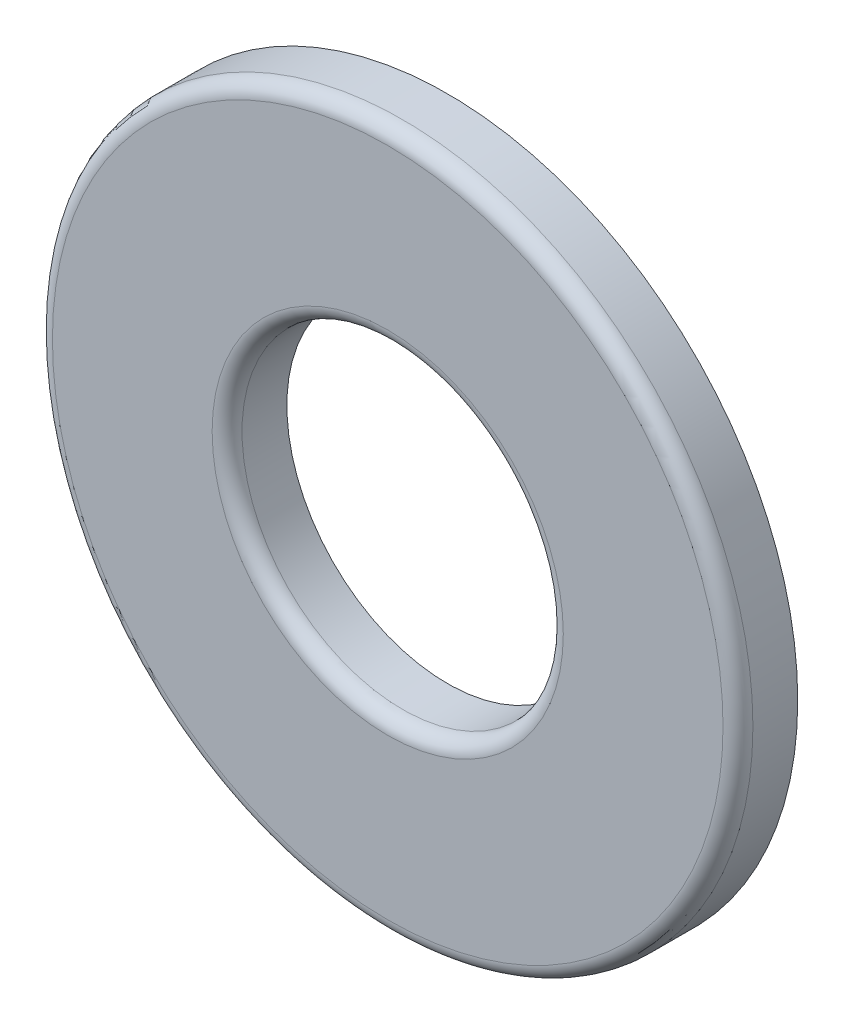
ISO-10303-21;
HEADER;
FILE_DESCRIPTION(('STEP AP214'),'2;1');
FILE_NAME('part.step','',(''),(''),'','','');
FILE_SCHEMA(('AUTOMOTIVE_DESIGN { 1 0 10303 214 1 1 1 1 }'));
ENDSEC;
DATA;
#1=APPLICATION_CONTEXT('core data for automotive mechanical design processes');
#2=APPLICATION_PROTOCOL_DEFINITION('international standard','automotive_design',2000,#1);
#3=PRODUCT_CONTEXT('',#1,'mechanical');
#4=PRODUCT('Part','Part','',(#3));
#5=PRODUCT_RELATED_PRODUCT_CATEGORY('part','',(#4));
#6=PRODUCT_DEFINITION_FORMATION('','',#4);
#7=PRODUCT_DEFINITION_CONTEXT('part definition',#1,'design');
#8=PRODUCT_DEFINITION('design','',#6,#7);
#9=PRODUCT_DEFINITION_SHAPE('','',#8);
#10=(LENGTH_UNIT() NAMED_UNIT(*) SI_UNIT(.MILLI.,.METRE.));
#11=(NAMED_UNIT(*) PLANE_ANGLE_UNIT() SI_UNIT($,.RADIAN.));
#12=(NAMED_UNIT(*) SI_UNIT($,.STERADIAN.) SOLID_ANGLE_UNIT());
#13=UNCERTAINTY_MEASURE_WITH_UNIT(LENGTH_MEASURE(1.E-05),#10,'distance_accuracy_value','');
#14=(GEOMETRIC_REPRESENTATION_CONTEXT(3) GLOBAL_UNCERTAINTY_ASSIGNED_CONTEXT((#13)) GLOBAL_UNIT_ASSIGNED_CONTEXT((#10,
#11,#12)) REPRESENTATION_CONTEXT('',''));
#15=CARTESIAN_POINT('',(0.,0.,0.));
#16=DIRECTION('',(0.,0.,1.));
#17=DIRECTION('',(1.,0.,0.));
#18=AXIS2_PLACEMENT_3D('',#15,#16,#17);
#19=CARTESIAN_POINT('',(0.,0.,0.406399999999997));
#20=DIRECTION('',(0.,0.,1.));
#21=DIRECTION('',(1.,0.,0.));
#22=AXIS2_PLACEMENT_3D('',#19,#20,#21);
#23=PLANE('',#22);
#24=CARTESIAN_POINT('',(0.,0.,0.406399999999997));
#25=DIRECTION('',(0.,0.,1.));
#26=DIRECTION('',(1.,0.,0.));
#27=AXIS2_PLACEMENT_3D('',#24,#25,#26);
#28=CIRCLE('',#27,4.5593);
#29=CARTESIAN_POINT('',(4.5593,0.,0.406399999999997));
#30=VERTEX_POINT('',#29);
#31=EDGE_CURVE('E55',#30,#30,#28,.T.);
#32=ORIENTED_EDGE('',*,*,#31,.T.);
#33=EDGE_LOOP('',(#32));
#34=FACE_BOUND('',#33,.T.);
#35=CARTESIAN_POINT('',(0.,0.,0.406399999999997));
#36=DIRECTION('',(0.,0.,1.));
#37=DIRECTION('',(1.,0.,0.));
#38=AXIS2_PLACEMENT_3D('',#35,#36,#37);
#39=CIRCLE('',#38,2.3876);
#40=CARTESIAN_POINT('',(2.3876,0.,0.406399999999997));
#41=VERTEX_POINT('',#40);
#42=EDGE_CURVE('E61',#41,#41,#39,.F.);
#43=ORIENTED_EDGE('',*,*,#42,.T.);
#44=EDGE_LOOP('',(#43));
#45=FACE_BOUND('',#44,.T.);
#46=ADVANCED_FACE('F41',(#34,#45),#23,.T.);
#47=CARTESIAN_POINT('',(0.,0.,0.406399999999997));
#48=DIRECTION('',(0.,0.,-1.));
#49=DIRECTION('',(-1.,0.,0.));
#50=AXIS2_PLACEMENT_3D('',#47,#48,#49);
#51=CYLINDRICAL_SURFACE('',#50,4.7625);
#52=CARTESIAN_POINT('',(0.,0.,0.203199999999997));
#53=DIRECTION('',(0.,0.,1.));
#54=DIRECTION('',(1.,0.,0.));
#55=AXIS2_PLACEMENT_3D('',#52,#53,#54);
#56=CIRCLE('',#55,4.7625);
#57=CARTESIAN_POINT('',(4.7625,0.,0.203199999999997));
#58=VERTEX_POINT('',#57);
#59=EDGE_CURVE('E49',#58,#58,#56,.F.);
#60=ORIENTED_EDGE('',*,*,#59,.T.);
#61=EDGE_LOOP('',(#60));
#62=FACE_BOUND('',#61,.T.);
#63=CARTESIAN_POINT('',(0.,0.,-0.406400000000003));
#64=DIRECTION('',(0.,0.,1.));
#65=DIRECTION('',(1.,0.,0.));
#66=AXIS2_PLACEMENT_3D('',#63,#64,#65);
#67=CIRCLE('',#66,4.7625);
#68=CARTESIAN_POINT('',(4.7625,0.,-0.406400000000003));
#69=VERTEX_POINT('',#68);
#70=EDGE_CURVE('E67',#69,#69,#67,.T.);
#71=ORIENTED_EDGE('',*,*,#70,.T.);
#72=EDGE_LOOP('',(#71));
#73=FACE_BOUND('',#72,.T.);
#74=ADVANCED_FACE('F82',(#62,#73),#51,.T.);
#75=CARTESIAN_POINT('',(0.,0.,0.406399999999997));
#76=DIRECTION('',(0.,0.,-1.));
#77=DIRECTION('',(-1.,0.,0.));
#78=AXIS2_PLACEMENT_3D('',#75,#76,#77);
#79=CYLINDRICAL_SURFACE('',#78,2.1844);
#80=CARTESIAN_POINT('',(0.,0.,0.203199999999997));
#81=DIRECTION('',(0.,0.,1.));
#82=DIRECTION('',(1.,0.,0.));
#83=AXIS2_PLACEMENT_3D('',#80,#81,#82);
#84=CIRCLE('',#83,2.1844);
#85=CARTESIAN_POINT('',(2.1844,0.,0.203199999999997));
#86=VERTEX_POINT('',#85);
#87=EDGE_CURVE('E10',#86,#86,#84,.T.);
#88=ORIENTED_EDGE('',*,*,#87,.T.);
#89=EDGE_LOOP('',(#88));
#90=FACE_BOUND('',#89,.T.);
#91=CARTESIAN_POINT('',(0.,0.,-0.406400000000003));
#92=DIRECTION('',(0.,0.,1.));
#93=DIRECTION('',(1.,0.,0.));
#94=AXIS2_PLACEMENT_3D('',#91,#92,#93);
#95=CIRCLE('',#94,2.1844);
#96=CARTESIAN_POINT('',(2.1844,0.,-0.406400000000003));
#97=VERTEX_POINT('',#96);
#98=EDGE_CURVE('E71',#97,#97,#95,.T.);
#99=ORIENTED_EDGE('',*,*,#98,.F.);
#100=EDGE_LOOP('',(#99));
#101=FACE_BOUND('',#100,.T.);
#102=ADVANCED_FACE('F80',(#90,#101),#79,.F.);
#103=CARTESIAN_POINT('',(0.,0.,-0.406400000000003));
#104=DIRECTION('',(0.,0.,1.));
#105=DIRECTION('',(1.,0.,0.));
#106=AXIS2_PLACEMENT_3D('',#103,#104,#105);
#107=PLANE('',#106);
#108=ORIENTED_EDGE('',*,*,#98,.T.);
#109=EDGE_LOOP('',(#108));
#110=FACE_BOUND('',#109,.T.);
#111=ORIENTED_EDGE('',*,*,#70,.F.);
#112=EDGE_LOOP('',(#111));
#113=FACE_BOUND('',#112,.T.);
#114=ADVANCED_FACE('F77',(#110,#113),#107,.F.);
#115=CARTESIAN_POINT('',(0.,0.,0.203199999999997));
#116=DIRECTION('',(0.,0.,1.));
#117=DIRECTION('',(1.,0.,0.));
#118=AXIS2_PLACEMENT_3D('',#115,#116,#117);
#119=TOROIDAL_SURFACE('',#118,4.5593,0.2032);
#120=ORIENTED_EDGE('',*,*,#59,.F.);
#121=EDGE_LOOP('',(#120));
#122=FACE_BOUND('',#121,.T.);
#123=ORIENTED_EDGE('',*,*,#31,.F.);
#124=EDGE_LOOP('',(#123));
#125=FACE_BOUND('',#124,.T.);
#126=ADVANCED_FACE('F88',(#122,#125),#119,.T.);
#127=CARTESIAN_POINT('',(0.,0.,0.203199999999997));
#128=DIRECTION('',(0.,0.,1.));
#129=DIRECTION('',(1.,0.,0.));
#130=AXIS2_PLACEMENT_3D('',#127,#128,#129);
#131=TOROIDAL_SURFACE('',#130,2.3876,0.2032);
#132=ORIENTED_EDGE('',*,*,#42,.F.);
#133=EDGE_LOOP('',(#132));
#134=FACE_BOUND('',#133,.T.);
#135=ORIENTED_EDGE('',*,*,#87,.F.);
#136=EDGE_LOOP('',(#135));
#137=FACE_BOUND('',#136,.T.);
#138=ADVANCED_FACE('F43',(#134,#137),#131,.T.);
#139=CLOSED_SHELL('',(#46,#74,#102,#114,#126,#138));
#140=MANIFOLD_SOLID_BREP('B2',#139);
#141=ADVANCED_BREP_SHAPE_REPRESENTATION('',(#18,#140),#14);
#142=SHAPE_DEFINITION_REPRESENTATION(#9,#141);
ENDSEC;
END-ISO-10303-21;
